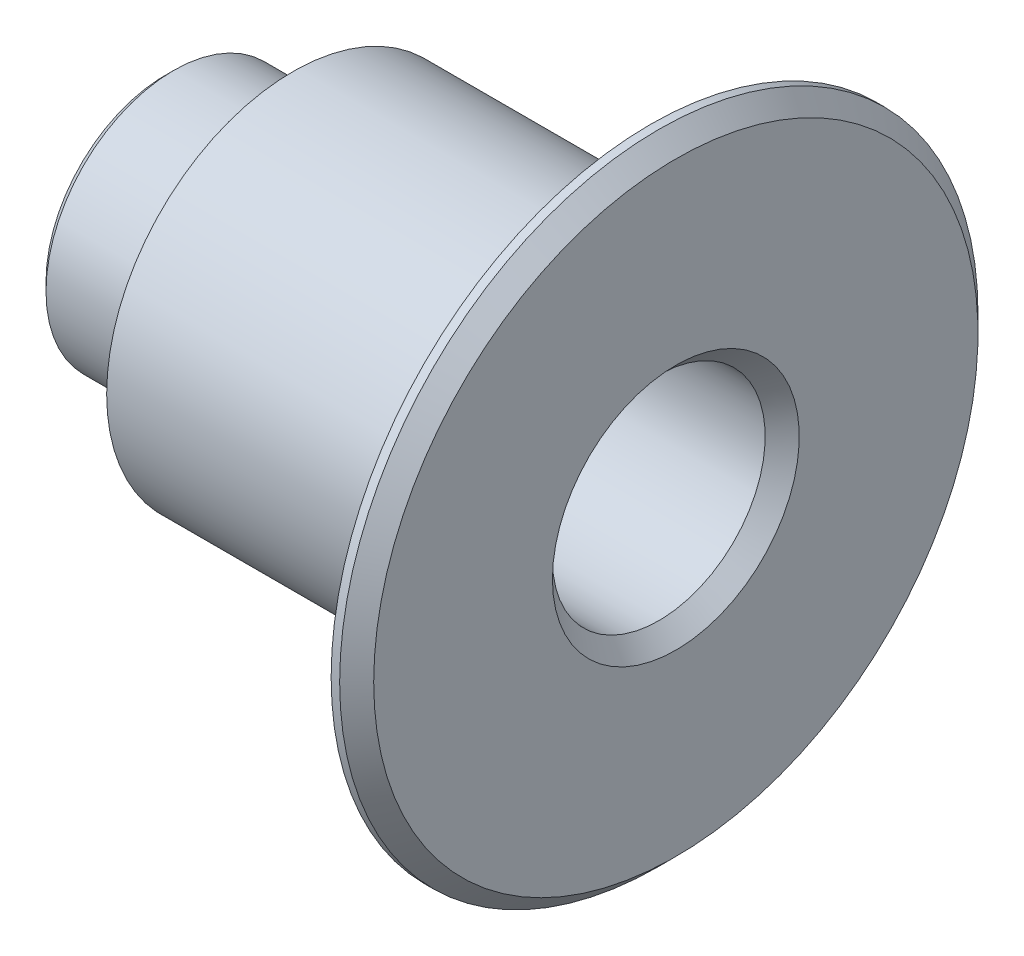
ISO-10303-21;
HEADER;
FILE_DESCRIPTION(('STEP AP214'),'2;1');
FILE_NAME('part.step','',(''),(''),'','','');
FILE_SCHEMA(('AUTOMOTIVE_DESIGN { 1 0 10303 214 1 1 1 1 }'));
ENDSEC;
DATA;
#1=APPLICATION_CONTEXT('core data for automotive mechanical design processes');
#2=APPLICATION_PROTOCOL_DEFINITION('international standard','automotive_design',2000,#1);
#3=PRODUCT_CONTEXT('',#1,'mechanical');
#4=PRODUCT('Part','Part','',(#3));
#5=PRODUCT_RELATED_PRODUCT_CATEGORY('part','',(#4));
#6=PRODUCT_DEFINITION_FORMATION('','',#4);
#7=PRODUCT_DEFINITION_CONTEXT('part definition',#1,'design');
#8=PRODUCT_DEFINITION('design','',#6,#7);
#9=PRODUCT_DEFINITION_SHAPE('','',#8);
#10=(LENGTH_UNIT() NAMED_UNIT(*) SI_UNIT(.MILLI.,.METRE.));
#11=(NAMED_UNIT(*) PLANE_ANGLE_UNIT() SI_UNIT($,.RADIAN.));
#12=(NAMED_UNIT(*) SI_UNIT($,.STERADIAN.) SOLID_ANGLE_UNIT());
#13=UNCERTAINTY_MEASURE_WITH_UNIT(LENGTH_MEASURE(1.E-05),#10,'distance_accuracy_value','');
#14=(GEOMETRIC_REPRESENTATION_CONTEXT(3) GLOBAL_UNCERTAINTY_ASSIGNED_CONTEXT((#13)) GLOBAL_UNIT_ASSIGNED_CONTEXT((#10,
#11,#12)) REPRESENTATION_CONTEXT('',''));
#15=CARTESIAN_POINT('',(0.,0.,0.));
#16=DIRECTION('',(0.,0.,1.));
#17=DIRECTION('',(1.,0.,0.));
#18=AXIS2_PLACEMENT_3D('',#15,#16,#17);
#19=CARTESIAN_POINT('',(-57.9960667275976,0.,-3.35987581077214));
#20=DIRECTION('',(-1.,0.,0.));
#21=DIRECTION('',(0.,0.,1.));
#22=AXIS2_PLACEMENT_3D('',#19,#20,#21);
#23=CYLINDRICAL_SURFACE('',#22,5.55625);
#24=CARTESIAN_POINT('',(-54.1860667275976,0.,-3.35987581077214));
#25=DIRECTION('',(-1.,0.,0.));
#26=DIRECTION('',(0.,0.,1.));
#27=AXIS2_PLACEMENT_3D('',#24,#25,#26);
#28=CIRCLE('',#27,5.55625);
#29=CARTESIAN_POINT('',(-54.1860667275976,0.,2.19637418922786));
#30=VERTEX_POINT('',#29);
#31=EDGE_CURVE('E86',#30,#30,#28,.T.);
#32=ORIENTED_EDGE('',*,*,#31,.F.);
#33=EDGE_LOOP('',(#32));
#34=FACE_BOUND('',#33,.T.);
#35=CARTESIAN_POINT('',(-43.5180667275976,0.,-3.35987581077214));
#36=DIRECTION('',(-1.,0.,0.));
#37=DIRECTION('',(0.,0.,1.));
#38=AXIS2_PLACEMENT_3D('',#35,#36,#37);
#39=CIRCLE('',#38,5.55625);
#40=CARTESIAN_POINT('',(-43.5180667275976,0.,2.19637418922786));
#41=VERTEX_POINT('',#40);
#42=EDGE_CURVE('E99',#41,#41,#39,.T.);
#43=ORIENTED_EDGE('',*,*,#42,.T.);
#44=EDGE_LOOP('',(#43));
#45=FACE_BOUND('',#44,.T.);
#46=ADVANCED_FACE('F50',(#34,#45),#23,.T.);
#47=CARTESIAN_POINT('',(-54.1860667275976,0.,0.));
#48=DIRECTION('',(1.,0.,0.));
#49=DIRECTION('',(0.,0.,-1.));
#50=AXIS2_PLACEMENT_3D('',#47,#48,#49);
#51=PLANE('',#50);
#52=CARTESIAN_POINT('',(-54.1860667275976,0.,-3.35987581077214));
#53=DIRECTION('',(-1.,0.,0.));
#54=DIRECTION('',(0.,0.,1.));
#55=AXIS2_PLACEMENT_3D('',#52,#53,#54);
#56=CIRCLE('',#55,3.81);
#57=CARTESIAN_POINT('',(-54.1860667275976,0.,0.450124189227862));
#58=VERTEX_POINT('',#57);
#59=EDGE_CURVE('E95',#58,#58,#56,.T.);
#60=ORIENTED_EDGE('',*,*,#59,.F.);
#61=EDGE_LOOP('',(#60));
#62=FACE_BOUND('',#61,.T.);
#63=ORIENTED_EDGE('',*,*,#31,.T.);
#64=EDGE_LOOP('',(#63));
#65=FACE_BOUND('',#64,.T.);
#66=ADVANCED_FACE('F124',(#62,#65),#51,.F.);
#67=CARTESIAN_POINT('',(-57.9960667275976,0.,-3.35987581077214));
#68=DIRECTION('',(-1.,0.,0.));
#69=DIRECTION('',(0.,0.,1.));
#70=AXIS2_PLACEMENT_3D('',#67,#68,#69);
#71=CYLINDRICAL_SURFACE('',#70,3.81);
#72=CARTESIAN_POINT('',(-57.7420667275976,0.,-3.35987581077214));
#73=DIRECTION('',(1.,0.,0.));
#74=DIRECTION('',(0.,0.,-1.));
#75=AXIS2_PLACEMENT_3D('',#72,#73,#74);
#76=CIRCLE('',#75,3.81);
#77=CARTESIAN_POINT('',(-57.7420667275976,0.,-7.16987581077214));
#78=VERTEX_POINT('',#77);
#79=EDGE_CURVE('E77',#78,#78,#76,.T.);
#80=ORIENTED_EDGE('',*,*,#79,.T.);
#81=EDGE_LOOP('',(#80));
#82=FACE_BOUND('',#81,.T.);
#83=ORIENTED_EDGE('',*,*,#59,.T.);
#84=EDGE_LOOP('',(#83));
#85=FACE_BOUND('',#84,.T.);
#86=ADVANCED_FACE('F128',(#82,#85),#71,.T.);
#87=CARTESIAN_POINT('',(-57.9960667275976,0.,0.));
#88=DIRECTION('',(1.,0.,0.));
#89=DIRECTION('',(0.,0.,-1.));
#90=AXIS2_PLACEMENT_3D('',#87,#88,#89);
#91=PLANE('',#90);
#92=CARTESIAN_POINT('',(-57.9960667275976,0.,-3.35987581077214));
#93=DIRECTION('',(1.,0.,0.));
#94=DIRECTION('',(0.,0.,-1.));
#95=AXIS2_PLACEMENT_3D('',#92,#93,#94);
#96=CIRCLE('',#95,3.556);
#97=CARTESIAN_POINT('',(-57.9960667275976,0.,-6.91587581077214));
#98=VERTEX_POINT('',#97);
#99=EDGE_CURVE('E78',#98,#98,#96,.F.);
#100=ORIENTED_EDGE('',*,*,#99,.T.);
#101=EDGE_LOOP('',(#100));
#102=FACE_BOUND('',#101,.T.);
#103=CARTESIAN_POINT('',(-57.9960667275976,0.,-3.35987581077214));
#104=DIRECTION('',(1.,0.,0.));
#105=DIRECTION('',(0.,0.,-1.));
#106=AXIS2_PLACEMENT_3D('',#103,#104,#105);
#107=CIRCLE('',#106,3.429);
#108=CARTESIAN_POINT('',(-57.9960667275976,0.,-6.78887581077214));
#109=VERTEX_POINT('',#108);
#110=EDGE_CURVE('E84',#109,#109,#107,.T.);
#111=ORIENTED_EDGE('',*,*,#110,.T.);
#112=EDGE_LOOP('',(#111));
#113=FACE_BOUND('',#112,.T.);
#114=ADVANCED_FACE('F163',(#102,#113),#91,.F.);
#115=CARTESIAN_POINT('',(-57.9960667275976,0.,-3.35987581077214));
#116=DIRECTION('',(-1.,0.,0.));
#117=DIRECTION('',(0.,0.,1.));
#118=AXIS2_PLACEMENT_3D('',#115,#116,#117);
#119=CYLINDRICAL_SURFACE('',#118,3.175);
#120=CARTESIAN_POINT('',(-43.2640667275976,0.,-3.35987581077214));
#121=DIRECTION('',(-1.,0.,0.));
#122=DIRECTION('',(0.,0.,1.));
#123=AXIS2_PLACEMENT_3D('',#120,#121,#122);
#124=CIRCLE('',#123,3.175);
#125=CARTESIAN_POINT('',(-43.2640667275976,0.,-0.184875810772137));
#126=VERTEX_POINT('',#125);
#127=EDGE_CURVE('E62',#126,#126,#124,.F.);
#128=ORIENTED_EDGE('',*,*,#127,.T.);
#129=EDGE_LOOP('',(#128));
#130=FACE_BOUND('',#129,.T.);
#131=CARTESIAN_POINT('',(-57.7420667275976,0.,-3.35987581077214));
#132=DIRECTION('',(1.,0.,0.));
#133=DIRECTION('',(0.,0.,-1.));
#134=AXIS2_PLACEMENT_3D('',#131,#132,#133);
#135=CIRCLE('',#134,3.175);
#136=CARTESIAN_POINT('',(-57.7420667275976,0.,-6.53487581077214));
#137=VERTEX_POINT('',#136);
#138=EDGE_CURVE('E75',#137,#137,#135,.F.);
#139=ORIENTED_EDGE('',*,*,#138,.T.);
#140=EDGE_LOOP('',(#139));
#141=FACE_BOUND('',#140,.T.);
#142=ADVANCED_FACE('F123',(#130,#141),#119,.F.);
#143=CARTESIAN_POINT('',(-42.7560667275976,0.,0.));
#144=DIRECTION('',(-1.,0.,0.));
#145=DIRECTION('',(0.,0.,1.));
#146=AXIS2_PLACEMENT_3D('',#143,#144,#145);
#147=PLANE('',#146);
#148=CARTESIAN_POINT('',(-42.7560667275976,0.,-3.35987581077214));
#149=DIRECTION('',(-1.,0.,0.));
#150=DIRECTION('',(0.,0.,1.));
#151=AXIS2_PLACEMENT_3D('',#148,#149,#150);
#152=CIRCLE('',#151,9.017);
#153=CARTESIAN_POINT('',(-42.7560667275976,0.,5.65712418922787));
#154=VERTEX_POINT('',#153);
#155=EDGE_CURVE('E10',#154,#154,#152,.F.);
#156=ORIENTED_EDGE('',*,*,#155,.T.);
#157=EDGE_LOOP('',(#156));
#158=FACE_BOUND('',#157,.T.);
#159=CARTESIAN_POINT('',(-42.7560667275976,0.,-3.35987581077214));
#160=DIRECTION('',(-1.,0.,0.));
#161=DIRECTION('',(0.,0.,1.));
#162=AXIS2_PLACEMENT_3D('',#159,#160,#161);
#163=CIRCLE('',#162,3.68300000000002);
#164=CARTESIAN_POINT('',(-42.7560667275976,0.,0.323124189227879));
#165=VERTEX_POINT('',#164);
#166=EDGE_CURVE('E68',#165,#165,#163,.T.);
#167=ORIENTED_EDGE('',*,*,#166,.T.);
#168=EDGE_LOOP('',(#167));
#169=FACE_BOUND('',#168,.T.);
#170=ADVANCED_FACE('F113',(#158,#169),#147,.F.);
#171=CARTESIAN_POINT('',(-57.9960667275976,0.,-3.35987581077214));
#172=DIRECTION('',(-1.,0.,0.));
#173=DIRECTION('',(0.,0.,1.));
#174=AXIS2_PLACEMENT_3D('',#171,#172,#173);
#175=CYLINDRICAL_SURFACE('',#174,9.525);
#176=CARTESIAN_POINT('',(-43.2640667275976,0.,-3.35987581077214));
#177=DIRECTION('',(-1.,0.,0.));
#178=DIRECTION('',(0.,0.,1.));
#179=AXIS2_PLACEMENT_3D('',#176,#177,#178);
#180=CIRCLE('',#179,9.525);
#181=CARTESIAN_POINT('',(-43.2640667275976,0.,6.16512418922786));
#182=VERTEX_POINT('',#181);
#183=EDGE_CURVE('E57',#182,#182,#180,.T.);
#184=ORIENTED_EDGE('',*,*,#183,.T.);
#185=EDGE_LOOP('',(#184));
#186=FACE_BOUND('',#185,.T.);
#187=CARTESIAN_POINT('',(-43.5180667275976,0.,-3.35987581077214));
#188=DIRECTION('',(-1.,0.,0.));
#189=DIRECTION('',(0.,0.,1.));
#190=AXIS2_PLACEMENT_3D('',#187,#188,#189);
#191=CIRCLE('',#190,9.525);
#192=CARTESIAN_POINT('',(-43.5180667275976,0.,6.16512418922786));
#193=VERTEX_POINT('',#192);
#194=EDGE_CURVE('E96',#193,#193,#191,.T.);
#195=ORIENTED_EDGE('',*,*,#194,.F.);
#196=EDGE_LOOP('',(#195));
#197=FACE_BOUND('',#196,.T.);
#198=ADVANCED_FACE('F109',(#186,#197),#175,.T.);
#199=CARTESIAN_POINT('',(-43.5180667275976,0.,0.));
#200=DIRECTION('',(1.,0.,0.));
#201=DIRECTION('',(0.,0.,-1.));
#202=AXIS2_PLACEMENT_3D('',#199,#200,#201);
#203=PLANE('',#202);
#204=ORIENTED_EDGE('',*,*,#42,.F.);
#205=EDGE_LOOP('',(#204));
#206=FACE_BOUND('',#205,.T.);
#207=ORIENTED_EDGE('',*,*,#194,.T.);
#208=EDGE_LOOP('',(#207));
#209=FACE_BOUND('',#208,.T.);
#210=ADVANCED_FACE('F106',(#206,#209),#203,.F.);
#211=CARTESIAN_POINT('',(-57.9960667275976,0.,-3.35987581077214));
#212=DIRECTION('',(1.,0.,0.));
#213=DIRECTION('',(0.,0.,-1.));
#214=AXIS2_PLACEMENT_3D('',#211,#212,#213);
#215=CONICAL_SURFACE('',#214,3.556,0.785398163397452);
#216=ORIENTED_EDGE('',*,*,#79,.F.);
#217=EDGE_LOOP('',(#216));
#218=FACE_BOUND('',#217,.T.);
#219=ORIENTED_EDGE('',*,*,#99,.F.);
#220=EDGE_LOOP('',(#219));
#221=FACE_BOUND('',#220,.T.);
#222=ADVANCED_FACE('F108',(#218,#221),#215,.T.);
#223=CARTESIAN_POINT('',(-57.7420667275976,0.,-3.35987581077214));
#224=DIRECTION('',(-1.,0.,0.));
#225=DIRECTION('',(0.,0.,1.));
#226=AXIS2_PLACEMENT_3D('',#223,#224,#225);
#227=CONICAL_SURFACE('',#226,3.175,0.785398163397457);
#228=ORIENTED_EDGE('',*,*,#110,.F.);
#229=EDGE_LOOP('',(#228));
#230=FACE_BOUND('',#229,.T.);
#231=ORIENTED_EDGE('',*,*,#138,.F.);
#232=EDGE_LOOP('',(#231));
#233=FACE_BOUND('',#232,.T.);
#234=ADVANCED_FACE('F142',(#230,#233),#227,.F.);
#235=CARTESIAN_POINT('',(-42.7560667275976,0.,-3.35987581077214));
#236=DIRECTION('',(1.,0.,0.));
#237=DIRECTION('',(0.,0.,-1.));
#238=AXIS2_PLACEMENT_3D('',#235,#236,#237);
#239=CONICAL_SURFACE('',#238,3.68300000000002,0.785398163397449);
#240=ORIENTED_EDGE('',*,*,#127,.F.);
#241=EDGE_LOOP('',(#240));
#242=FACE_BOUND('',#241,.T.);
#243=ORIENTED_EDGE('',*,*,#166,.F.);
#244=EDGE_LOOP('',(#243));
#245=FACE_BOUND('',#244,.T.);
#246=ADVANCED_FACE('F146',(#242,#245),#239,.F.);
#247=CARTESIAN_POINT('',(-43.2640667275976,0.,-3.35987581077214));
#248=DIRECTION('',(-1.,0.,0.));
#249=DIRECTION('',(0.,0.,1.));
#250=AXIS2_PLACEMENT_3D('',#247,#248,#249);
#251=CONICAL_SURFACE('',#250,9.525,0.785398163397445);
#252=ORIENTED_EDGE('',*,*,#155,.F.);
#253=EDGE_LOOP('',(#252));
#254=FACE_BOUND('',#253,.T.);
#255=ORIENTED_EDGE('',*,*,#183,.F.);
#256=EDGE_LOOP('',(#255));
#257=FACE_BOUND('',#256,.T.);
#258=ADVANCED_FACE('F49',(#254,#257),#251,.T.);
#259=CLOSED_SHELL('',(#46,#66,#86,#114,#142,#170,#198,#210,#222,#234,#246,#258));
#260=MANIFOLD_SOLID_BREP('B2',#259);
#261=ADVANCED_BREP_SHAPE_REPRESENTATION('',(#18,#260),#14);
#262=SHAPE_DEFINITION_REPRESENTATION(#9,#261);
ENDSEC;
END-ISO-10303-21;
